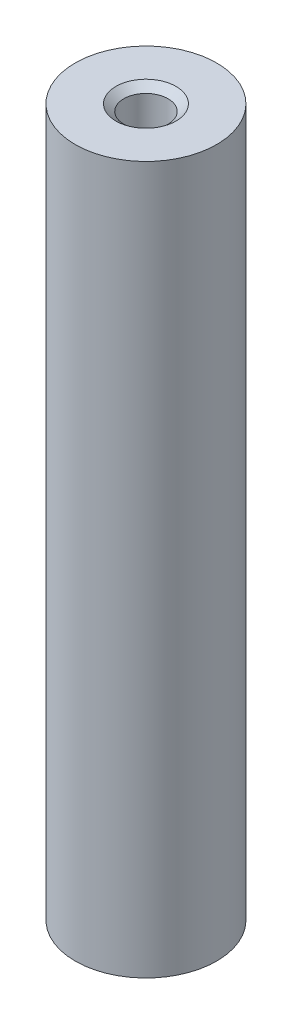
ISO-10303-21;
HEADER;
FILE_DESCRIPTION(('STEP AP214'),'2;1');
FILE_NAME('part.step','',(''),(''),'','','');
FILE_SCHEMA(('AUTOMOTIVE_DESIGN { 1 0 10303 214 1 1 1 1 }'));
ENDSEC;
DATA;
#1=APPLICATION_CONTEXT('core data for automotive mechanical design processes');
#2=APPLICATION_PROTOCOL_DEFINITION('international standard','automotive_design',2000,#1);
#3=PRODUCT_CONTEXT('',#1,'mechanical');
#4=PRODUCT('Part','Part','',(#3));
#5=PRODUCT_RELATED_PRODUCT_CATEGORY('part','',(#4));
#6=PRODUCT_DEFINITION_FORMATION('','',#4);
#7=PRODUCT_DEFINITION_CONTEXT('part definition',#1,'design');
#8=PRODUCT_DEFINITION('design','',#6,#7);
#9=PRODUCT_DEFINITION_SHAPE('','',#8);
#10=(LENGTH_UNIT() NAMED_UNIT(*) SI_UNIT(.MILLI.,.METRE.));
#11=(NAMED_UNIT(*) PLANE_ANGLE_UNIT() SI_UNIT($,.RADIAN.));
#12=(NAMED_UNIT(*) SI_UNIT($,.STERADIAN.) SOLID_ANGLE_UNIT());
#13=UNCERTAINTY_MEASURE_WITH_UNIT(LENGTH_MEASURE(1.E-05),#10,'distance_accuracy_value','');
#14=(GEOMETRIC_REPRESENTATION_CONTEXT(3) GLOBAL_UNCERTAINTY_ASSIGNED_CONTEXT((#13)) GLOBAL_UNIT_ASSIGNED_CONTEXT((#10,
#11,#12)) REPRESENTATION_CONTEXT('',''));
#15=CARTESIAN_POINT('',(0.,0.,0.));
#16=DIRECTION('',(0.,0.,1.));
#17=DIRECTION('',(1.,0.,0.));
#18=AXIS2_PLACEMENT_3D('',#15,#16,#17);
#19=CARTESIAN_POINT('',(0.,127.,0.));
#20=DIRECTION('',(0.,-1.,0.));
#21=DIRECTION('',(0.,0.,-1.));
#22=AXIS2_PLACEMENT_3D('',#19,#20,#21);
#23=CYLINDRICAL_SURFACE('',#22,12.7);
#24=CARTESIAN_POINT('',(0.,127.,0.));
#25=DIRECTION('',(0.,1.,0.));
#26=DIRECTION('',(0.,0.,1.));
#27=AXIS2_PLACEMENT_3D('',#24,#25,#26);
#28=CIRCLE('',#27,12.7);
#29=CARTESIAN_POINT('',(0.,127.,12.7));
#30=VERTEX_POINT('',#29);
#31=EDGE_CURVE('E11',#30,#30,#28,.T.);
#32=ORIENTED_EDGE('',*,*,#31,.F.);
#33=EDGE_LOOP('',(#32));
#34=FACE_BOUND('',#33,.T.);
#35=CARTESIAN_POINT('',(0.,0.,0.));
#36=DIRECTION('',(0.,1.,0.));
#37=DIRECTION('',(0.,0.,1.));
#38=AXIS2_PLACEMENT_3D('',#35,#36,#37);
#39=CIRCLE('',#38,12.7);
#40=CARTESIAN_POINT('',(0.,0.,12.7));
#41=VERTEX_POINT('',#40);
#42=EDGE_CURVE('E52',#41,#41,#39,.T.);
#43=ORIENTED_EDGE('',*,*,#42,.T.);
#44=EDGE_LOOP('',(#43));
#45=FACE_BOUND('',#44,.T.);
#46=ADVANCED_FACE('F49',(#34,#45),#23,.T.);
#47=CARTESIAN_POINT('',(0.,127.,0.));
#48=DIRECTION('',(0.,1.,0.));
#49=DIRECTION('',(0.,0.,1.));
#50=AXIS2_PLACEMENT_3D('',#47,#48,#49);
#51=PLANE('',#50);
#52=CARTESIAN_POINT('',(0.,127.,0.));
#53=DIRECTION('',(0.,1.,0.));
#54=DIRECTION('',(0.,0.,1.));
#55=AXIS2_PLACEMENT_3D('',#52,#53,#54);
#56=CIRCLE('',#55,5.3975);
#57=CARTESIAN_POINT('',(0.,127.,5.3975));
#58=VERTEX_POINT('',#57);
#59=EDGE_CURVE('E79',#58,#58,#56,.T.);
#60=ORIENTED_EDGE('',*,*,#59,.F.);
#61=EDGE_LOOP('',(#60));
#62=FACE_BOUND('',#61,.T.);
#63=ORIENTED_EDGE('',*,*,#31,.T.);
#64=EDGE_LOOP('',(#63));
#65=FACE_BOUND('',#64,.T.);
#66=ADVANCED_FACE('F96',(#62,#65),#51,.T.);
#67=CARTESIAN_POINT('',(0.,0.,0.));
#68=DIRECTION('',(0.,1.,0.));
#69=DIRECTION('',(0.,0.,1.));
#70=AXIS2_PLACEMENT_3D('',#67,#68,#69);
#71=PLANE('',#70);
#72=CARTESIAN_POINT('',(0.,0.,0.));
#73=DIRECTION('',(0.,-1.,0.));
#74=DIRECTION('',(0.,0.,-1.));
#75=AXIS2_PLACEMENT_3D('',#72,#73,#74);
#76=CIRCLE('',#75,6.985);
#77=CARTESIAN_POINT('',(0.,0.,-6.985));
#78=VERTEX_POINT('',#77);
#79=EDGE_CURVE('E72',#78,#78,#76,.T.);
#80=ORIENTED_EDGE('',*,*,#79,.F.);
#81=EDGE_LOOP('',(#80));
#82=FACE_BOUND('',#81,.T.);
#83=ORIENTED_EDGE('',*,*,#42,.F.);
#84=EDGE_LOOP('',(#83));
#85=FACE_BOUND('',#84,.T.);
#86=ADVANCED_FACE('F93',(#82,#85),#71,.F.);
#87=CARTESIAN_POINT('',(0.,25.4,0.));
#88=DIRECTION('',(0.,-1.,0.));
#89=DIRECTION('',(0.,0.,-1.));
#90=AXIS2_PLACEMENT_3D('',#87,#88,#89);
#91=CONICAL_SURFACE('',#90,5.35812999999999,1.02974425867665);
#92=CARTESIAN_POINT('',(0.,28.6194893086301,0.));
#93=VERTEX_POINT('',#92);
#94=VERTEX_LOOP('',#93);
#95=FACE_BOUND('',#94,.T.);
#96=CARTESIAN_POINT('',(0.,25.4,0.));
#97=DIRECTION('',(0.,-1.,0.));
#98=DIRECTION('',(0.,0.,-1.));
#99=AXIS2_PLACEMENT_3D('',#96,#97,#98);
#100=CIRCLE('',#99,5.35812999999999);
#101=CARTESIAN_POINT('',(0.,25.4,-5.35812999999999));
#102=VERTEX_POINT('',#101);
#103=EDGE_CURVE('E85',#102,#102,#100,.T.);
#104=ORIENTED_EDGE('',*,*,#103,.T.);
#105=EDGE_LOOP('',(#104));
#106=FACE_BOUND('',#105,.T.);
#107=ADVANCED_FACE('F95',(#95,#106),#91,.F.);
#108=CARTESIAN_POINT('',(0.,0.,0.));
#109=DIRECTION('',(0.,-1.,0.));
#110=DIRECTION('',(0.,0.,-1.));
#111=AXIS2_PLACEMENT_3D('',#108,#109,#110);
#112=CYLINDRICAL_SURFACE('',#111,5.35813);
#113=ORIENTED_EDGE('',*,*,#103,.F.);
#114=EDGE_LOOP('',(#113));
#115=FACE_BOUND('',#114,.T.);
#116=CARTESIAN_POINT('',(0.,1.36510601697338,0.));
#117=DIRECTION('',(0.,-1.,0.));
#118=DIRECTION('',(0.,0.,-1.));
#119=AXIS2_PLACEMENT_3D('',#116,#117,#118);
#120=CIRCLE('',#119,5.35813);
#121=CARTESIAN_POINT('',(0.,1.36510601697338,-5.35813));
#122=VERTEX_POINT('',#121);
#123=EDGE_CURVE('E76',#122,#122,#120,.T.);
#124=ORIENTED_EDGE('',*,*,#123,.T.);
#125=EDGE_LOOP('',(#124));
#126=FACE_BOUND('',#125,.T.);
#127=ADVANCED_FACE('F103',(#115,#126),#112,.F.);
#128=CARTESIAN_POINT('',(0.,0.,0.));
#129=DIRECTION('',(0.,-1.,0.));
#130=DIRECTION('',(0.,0.,-1.));
#131=AXIS2_PLACEMENT_3D('',#128,#129,#130);
#132=CONICAL_SURFACE('',#131,6.985,0.872664625997166);
#133=ORIENTED_EDGE('',*,*,#123,.F.);
#134=EDGE_LOOP('',(#133));
#135=FACE_BOUND('',#134,.T.);
#136=ORIENTED_EDGE('',*,*,#79,.T.);
#137=EDGE_LOOP('',(#136));
#138=FACE_BOUND('',#137,.T.);
#139=ADVANCED_FACE('F66',(#135,#138),#132,.F.);
#140=CARTESIAN_POINT('',(0.,101.6,0.));
#141=DIRECTION('',(0.,1.,0.));
#142=DIRECTION('',(0.,0.,1.));
#143=AXIS2_PLACEMENT_3D('',#140,#141,#142);
#144=CONICAL_SURFACE('',#143,3.96874999999999,1.02974425867666);
#145=CARTESIAN_POINT('',(0.,99.2153344182344,0.));
#146=VERTEX_POINT('',#145);
#147=VERTEX_LOOP('',#146);
#148=FACE_BOUND('',#147,.T.);
#149=CARTESIAN_POINT('',(0.,101.6,0.));
#150=DIRECTION('',(0.,1.,0.));
#151=DIRECTION('',(0.,0.,1.));
#152=AXIS2_PLACEMENT_3D('',#149,#150,#151);
#153=CIRCLE('',#152,3.96874999999999);
#154=CARTESIAN_POINT('',(0.,101.6,3.96874999999999));
#155=VERTEX_POINT('',#154);
#156=EDGE_CURVE('E70',#155,#155,#153,.T.);
#157=ORIENTED_EDGE('',*,*,#156,.T.);
#158=EDGE_LOOP('',(#157));
#159=FACE_BOUND('',#158,.T.);
#160=ADVANCED_FACE('F62',(#148,#159),#144,.F.);
#161=CARTESIAN_POINT('',(0.,127.,0.));
#162=DIRECTION('',(0.,1.,0.));
#163=DIRECTION('',(0.,0.,1.));
#164=AXIS2_PLACEMENT_3D('',#161,#162,#163);
#165=CYLINDRICAL_SURFACE('',#164,3.96875);
#166=ORIENTED_EDGE('',*,*,#156,.F.);
#167=EDGE_LOOP('',(#166));
#168=FACE_BOUND('',#167,.T.);
#169=CARTESIAN_POINT('',(0.,125.801136401955,0.));
#170=DIRECTION('',(0.,1.,0.));
#171=DIRECTION('',(0.,0.,1.));
#172=AXIS2_PLACEMENT_3D('',#169,#170,#171);
#173=CIRCLE('',#172,3.96875);
#174=CARTESIAN_POINT('',(0.,125.801136401955,3.96875));
#175=VERTEX_POINT('',#174);
#176=EDGE_CURVE('E73',#175,#175,#173,.T.);
#177=ORIENTED_EDGE('',*,*,#176,.T.);
#178=EDGE_LOOP('',(#177));
#179=FACE_BOUND('',#178,.T.);
#180=ADVANCED_FACE('F65',(#168,#179),#165,.F.);
#181=CARTESIAN_POINT('',(0.,127.,0.));
#182=DIRECTION('',(0.,1.,0.));
#183=DIRECTION('',(0.,0.,1.));
#184=AXIS2_PLACEMENT_3D('',#181,#182,#183);
#185=CONICAL_SURFACE('',#184,5.3975,0.872664625997171);
#186=ORIENTED_EDGE('',*,*,#176,.F.);
#187=EDGE_LOOP('',(#186));
#188=FACE_BOUND('',#187,.T.);
#189=ORIENTED_EDGE('',*,*,#59,.T.);
#190=EDGE_LOOP('',(#189));
#191=FACE_BOUND('',#190,.T.);
#192=ADVANCED_FACE('F162',(#188,#191),#185,.F.);
#193=CLOSED_SHELL('',(#46,#66,#86,#107,#127,#139,#160,#180,#192));
#194=MANIFOLD_SOLID_BREP('B2',#193);
#195=ADVANCED_BREP_SHAPE_REPRESENTATION('',(#18,#194),#14);
#196=SHAPE_DEFINITION_REPRESENTATION(#9,#195);
ENDSEC;
END-ISO-10303-21;
